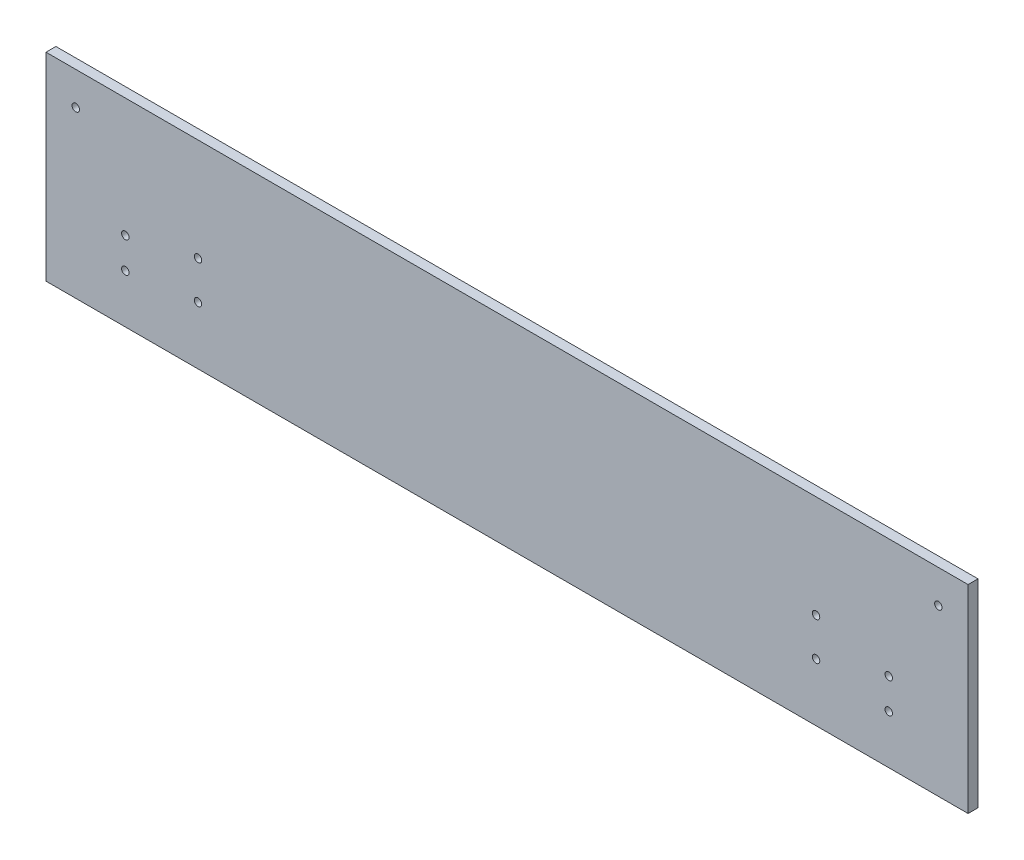
ISO-10303-21;
HEADER;
FILE_DESCRIPTION(('STEP AP214'),'2;1');
FILE_NAME('part.step','',(''),(''),'','','');
FILE_SCHEMA(('AUTOMOTIVE_DESIGN { 1 0 10303 214 1 1 1 1 }'));
ENDSEC;
DATA;
#1=APPLICATION_CONTEXT('core data for automotive mechanical design processes');
#2=APPLICATION_PROTOCOL_DEFINITION('international standard','automotive_design',2000,#1);
#3=PRODUCT_CONTEXT('',#1,'mechanical');
#4=PRODUCT('Part','Part','',(#3));
#5=PRODUCT_RELATED_PRODUCT_CATEGORY('part','',(#4));
#6=PRODUCT_DEFINITION_FORMATION('','',#4);
#7=PRODUCT_DEFINITION_CONTEXT('part definition',#1,'design');
#8=PRODUCT_DEFINITION('design','',#6,#7);
#9=PRODUCT_DEFINITION_SHAPE('','',#8);
#10=(LENGTH_UNIT() NAMED_UNIT(*) SI_UNIT(.MILLI.,.METRE.));
#11=(NAMED_UNIT(*) PLANE_ANGLE_UNIT() SI_UNIT($,.RADIAN.));
#12=(NAMED_UNIT(*) SI_UNIT($,.STERADIAN.) SOLID_ANGLE_UNIT());
#13=UNCERTAINTY_MEASURE_WITH_UNIT(LENGTH_MEASURE(1.E-05),#10,'distance_accuracy_value','');
#14=(GEOMETRIC_REPRESENTATION_CONTEXT(3) GLOBAL_UNCERTAINTY_ASSIGNED_CONTEXT((#13)) GLOBAL_UNIT_ASSIGNED_CONTEXT((#10,
#11,#12)) REPRESENTATION_CONTEXT('',''));
#15=CARTESIAN_POINT('',(0.,0.,0.));
#16=DIRECTION('',(0.,0.,1.));
#17=DIRECTION('',(1.,0.,0.));
#18=AXIS2_PLACEMENT_3D('',#15,#16,#17);
#19=CARTESIAN_POINT('',(-279.,60.,6.));
#20=DIRECTION('',(1.,0.,0.));
#21=DIRECTION('',(0.,0.,-1.));
#22=AXIS2_PLACEMENT_3D('',#19,#20,#21);
#23=PLANE('',#22);
#24=DIRECTION('',(0.,-1.,0.));
#25=VECTOR('',#24,1.);
#26=CARTESIAN_POINT('',(-279.,60.,0.));
#27=LINE('',#26,#25);
#28=CARTESIAN_POINT('',(-279.,60.,0.));
#29=VERTEX_POINT('',#28);
#30=CARTESIAN_POINT('',(-279.,-60.,0.));
#31=VERTEX_POINT('',#30);
#32=EDGE_CURVE('E103',#29,#31,#27,.T.);
#33=ORIENTED_EDGE('',*,*,#32,.T.);
#34=DIRECTION('',(0.,0.,-1.));
#35=VECTOR('',#34,1.);
#36=CARTESIAN_POINT('',(-279.,-60.,6.));
#37=LINE('',#36,#35);
#38=CARTESIAN_POINT('',(-279.,-60.,6.));
#39=VERTEX_POINT('',#38);
#40=EDGE_CURVE('E11',#39,#31,#37,.T.);
#41=ORIENTED_EDGE('',*,*,#40,.F.);
#42=DIRECTION('',(0.,-1.,0.));
#43=VECTOR('',#42,1.);
#44=CARTESIAN_POINT('',(-279.,60.,6.));
#45=LINE('',#44,#43);
#46=CARTESIAN_POINT('',(-279.,60.,6.));
#47=VERTEX_POINT('',#46);
#48=EDGE_CURVE('E90',#47,#39,#45,.T.);
#49=ORIENTED_EDGE('',*,*,#48,.F.);
#50=DIRECTION('',(0.,0.,-1.));
#51=VECTOR('',#50,1.);
#52=CARTESIAN_POINT('',(-279.,60.,6.));
#53=LINE('',#52,#51);
#54=EDGE_CURVE('E99',#47,#29,#53,.T.);
#55=ORIENTED_EDGE('',*,*,#54,.T.);
#56=EDGE_LOOP('',(#33,#41,#49,#55));
#57=FACE_BOUND('',#56,.T.);
#58=ADVANCED_FACE('F37',(#57),#23,.F.);
#59=CARTESIAN_POINT('',(-279.,-60.,6.));
#60=DIRECTION('',(0.,1.,0.));
#61=DIRECTION('',(0.,0.,1.));
#62=AXIS2_PLACEMENT_3D('',#59,#60,#61);
#63=PLANE('',#62);
#64=DIRECTION('',(1.,0.,0.));
#65=VECTOR('',#64,1.);
#66=CARTESIAN_POINT('',(-279.,-60.,0.));
#67=LINE('',#66,#65);
#68=CARTESIAN_POINT('',(279.,-60.,0.));
#69=VERTEX_POINT('',#68);
#70=EDGE_CURVE('E94',#31,#69,#67,.T.);
#71=ORIENTED_EDGE('',*,*,#70,.T.);
#72=DIRECTION('',(0.,0.,-1.));
#73=VECTOR('',#72,1.);
#74=CARTESIAN_POINT('',(279.,-60.,6.));
#75=LINE('',#74,#73);
#76=CARTESIAN_POINT('',(279.,-60.,6.));
#77=VERTEX_POINT('',#76);
#78=EDGE_CURVE('E46',#77,#69,#75,.T.);
#79=ORIENTED_EDGE('',*,*,#78,.F.);
#80=DIRECTION('',(1.,0.,0.));
#81=VECTOR('',#80,1.);
#82=CARTESIAN_POINT('',(-279.,-60.,6.));
#83=LINE('',#82,#81);
#84=EDGE_CURVE('E85',#39,#77,#83,.T.);
#85=ORIENTED_EDGE('',*,*,#84,.F.);
#86=ORIENTED_EDGE('',*,*,#40,.T.);
#87=EDGE_LOOP('',(#71,#79,#85,#86));
#88=FACE_BOUND('',#87,.T.);
#89=ADVANCED_FACE('F93',(#88),#63,.F.);
#90=CARTESIAN_POINT('',(279.,60.,6.));
#91=DIRECTION('',(-1.,0.,0.));
#92=DIRECTION('',(0.,0.,1.));
#93=AXIS2_PLACEMENT_3D('',#90,#91,#92);
#94=PLANE('',#93);
#95=DIRECTION('',(0.,1.,0.));
#96=VECTOR('',#95,1.);
#97=CARTESIAN_POINT('',(279.,60.,0.));
#98=LINE('',#97,#96);
#99=CARTESIAN_POINT('',(279.,60.,0.));
#100=VERTEX_POINT('',#99);
#101=EDGE_CURVE('E72',#69,#100,#98,.T.);
#102=ORIENTED_EDGE('',*,*,#101,.T.);
#103=DIRECTION('',(0.,0.,-1.));
#104=VECTOR('',#103,1.);
#105=CARTESIAN_POINT('',(279.,60.,6.));
#106=LINE('',#105,#104);
#107=CARTESIAN_POINT('',(279.,60.,6.));
#108=VERTEX_POINT('',#107);
#109=EDGE_CURVE('E95',#108,#100,#106,.T.);
#110=ORIENTED_EDGE('',*,*,#109,.F.);
#111=DIRECTION('',(0.,1.,0.));
#112=VECTOR('',#111,1.);
#113=CARTESIAN_POINT('',(279.,60.,6.));
#114=LINE('',#113,#112);
#115=EDGE_CURVE('E88',#77,#108,#114,.T.);
#116=ORIENTED_EDGE('',*,*,#115,.F.);
#117=ORIENTED_EDGE('',*,*,#78,.T.);
#118=EDGE_LOOP('',(#102,#110,#116,#117));
#119=FACE_BOUND('',#118,.T.);
#120=ADVANCED_FACE('F97',(#119),#94,.F.);
#121=CARTESIAN_POINT('',(-279.,60.,6.));
#122=DIRECTION('',(0.,-1.,0.));
#123=DIRECTION('',(0.,0.,-1.));
#124=AXIS2_PLACEMENT_3D('',#121,#122,#123);
#125=PLANE('',#124);
#126=DIRECTION('',(-1.,0.,0.));
#127=VECTOR('',#126,1.);
#128=CARTESIAN_POINT('',(-279.,60.,0.));
#129=LINE('',#128,#127);
#130=EDGE_CURVE('E78',#100,#29,#129,.T.);
#131=ORIENTED_EDGE('',*,*,#130,.T.);
#132=ORIENTED_EDGE('',*,*,#54,.F.);
#133=DIRECTION('',(-1.,0.,0.));
#134=VECTOR('',#133,1.);
#135=CARTESIAN_POINT('',(-279.,60.,6.));
#136=LINE('',#135,#134);
#137=EDGE_CURVE('E55',#108,#47,#136,.T.);
#138=ORIENTED_EDGE('',*,*,#137,.F.);
#139=ORIENTED_EDGE('',*,*,#109,.T.);
#140=EDGE_LOOP('',(#131,#132,#138,#139));
#141=FACE_BOUND('',#140,.T.);
#142=ADVANCED_FACE('F174',(#141),#125,.F.);
#143=CARTESIAN_POINT('',(0.,0.,6.));
#144=DIRECTION('',(0.,0.,1.));
#145=DIRECTION('',(1.,0.,0.));
#146=AXIS2_PLACEMENT_3D('',#143,#144,#145);
#147=PLANE('',#146);
#148=CARTESIAN_POINT('',(261.,40.,6.));
#149=DIRECTION('',(0.,0.,1.));
#150=DIRECTION('',(1.,0.,0.));
#151=AXIS2_PLACEMENT_3D('',#148,#149,#150);
#152=CIRCLE('',#151,2.24999999999995);
#153=CARTESIAN_POINT('',(263.25,40.,6.));
#154=VERTEX_POINT('',#153);
#155=EDGE_CURVE('E360',#154,#154,#152,.T.);
#156=ORIENTED_EDGE('',*,*,#155,.F.);
#157=EDGE_LOOP('',(#156));
#158=FACE_BOUND('',#157,.T.);
#159=CARTESIAN_POINT('',(187.,-25.,6.));
#160=DIRECTION('',(0.,0.,1.));
#161=DIRECTION('',(1.,0.,0.));
#162=AXIS2_PLACEMENT_3D('',#159,#160,#161);
#163=CIRCLE('',#162,2.25000000000001);
#164=CARTESIAN_POINT('',(189.25,-25.,6.));
#165=VERTEX_POINT('',#164);
#166=EDGE_CURVE('E356',#165,#165,#163,.T.);
#167=ORIENTED_EDGE('',*,*,#166,.F.);
#168=EDGE_LOOP('',(#167));
#169=FACE_BOUND('',#168,.T.);
#170=CARTESIAN_POINT('',(187.,-2.,6.));
#171=DIRECTION('',(0.,0.,1.));
#172=DIRECTION('',(1.,0.,0.));
#173=AXIS2_PLACEMENT_3D('',#170,#171,#172);
#174=CIRCLE('',#173,2.25000000000001);
#175=CARTESIAN_POINT('',(189.25,-2.,6.));
#176=VERTEX_POINT('',#175);
#177=EDGE_CURVE('E331',#176,#176,#174,.T.);
#178=ORIENTED_EDGE('',*,*,#177,.F.);
#179=EDGE_LOOP('',(#178));
#180=FACE_BOUND('',#179,.T.);
#181=CARTESIAN_POINT('',(-187.,-2.,6.));
#182=DIRECTION('',(0.,0.,1.));
#183=DIRECTION('',(1.,0.,0.));
#184=AXIS2_PLACEMENT_3D('',#181,#182,#183);
#185=CIRCLE('',#184,2.25000000000001);
#186=CARTESIAN_POINT('',(-184.75,-2.,6.));
#187=VERTEX_POINT('',#186);
#188=EDGE_CURVE('E357',#187,#187,#185,.T.);
#189=ORIENTED_EDGE('',*,*,#188,.F.);
#190=EDGE_LOOP('',(#189));
#191=FACE_BOUND('',#190,.T.);
#192=CARTESIAN_POINT('',(-231.,-30.5,6.));
#193=DIRECTION('',(0.,0.,1.));
#194=DIRECTION('',(1.,0.,0.));
#195=AXIS2_PLACEMENT_3D('',#192,#193,#194);
#196=CIRCLE('',#195,2.25000000000001);
#197=CARTESIAN_POINT('',(-228.75,-30.5,6.));
#198=VERTEX_POINT('',#197);
#199=EDGE_CURVE('E375',#198,#198,#196,.T.);
#200=ORIENTED_EDGE('',*,*,#199,.F.);
#201=EDGE_LOOP('',(#200));
#202=FACE_BOUND('',#201,.T.);
#203=CARTESIAN_POINT('',(231.,-12.,6.));
#204=DIRECTION('',(0.,0.,1.));
#205=DIRECTION('',(1.,0.,0.));
#206=AXIS2_PLACEMENT_3D('',#203,#204,#205);
#207=CIRCLE('',#206,2.25000000000001);
#208=CARTESIAN_POINT('',(233.25,-12.,6.));
#209=VERTEX_POINT('',#208);
#210=EDGE_CURVE('E372',#209,#209,#207,.T.);
#211=ORIENTED_EDGE('',*,*,#210,.F.);
#212=EDGE_LOOP('',(#211));
#213=FACE_BOUND('',#212,.T.);
#214=CARTESIAN_POINT('',(231.,-30.5,6.));
#215=DIRECTION('',(0.,0.,1.));
#216=DIRECTION('',(1.,0.,0.));
#217=AXIS2_PLACEMENT_3D('',#214,#215,#216);
#218=CIRCLE('',#217,2.25000000000001);
#219=CARTESIAN_POINT('',(233.25,-30.5,6.));
#220=VERTEX_POINT('',#219);
#221=EDGE_CURVE('E369',#220,#220,#218,.T.);
#222=ORIENTED_EDGE('',*,*,#221,.F.);
#223=EDGE_LOOP('',(#222));
#224=FACE_BOUND('',#223,.T.);
#225=CARTESIAN_POINT('',(-261.,39.9999999999999,6.));
#226=DIRECTION('',(0.,0.,1.));
#227=DIRECTION('',(1.,0.,0.));
#228=AXIS2_PLACEMENT_3D('',#225,#226,#227);
#229=CIRCLE('',#228,2.24999999999995);
#230=CARTESIAN_POINT('',(-258.75,39.9999999999999,6.));
#231=VERTEX_POINT('',#230);
#232=EDGE_CURVE('E367',#231,#231,#229,.T.);
#233=ORIENTED_EDGE('',*,*,#232,.F.);
#234=EDGE_LOOP('',(#233));
#235=FACE_BOUND('',#234,.T.);
#236=CARTESIAN_POINT('',(-187.,-25.,6.));
#237=DIRECTION('',(0.,0.,1.));
#238=DIRECTION('',(1.,0.,0.));
#239=AXIS2_PLACEMENT_3D('',#236,#237,#238);
#240=CIRCLE('',#239,2.25000000000001);
#241=CARTESIAN_POINT('',(-184.75,-25.,6.));
#242=VERTEX_POINT('',#241);
#243=EDGE_CURVE('E363',#242,#242,#240,.T.);
#244=ORIENTED_EDGE('',*,*,#243,.F.);
#245=EDGE_LOOP('',(#244));
#246=FACE_BOUND('',#245,.T.);
#247=CARTESIAN_POINT('',(-231.,-12.,6.));
#248=DIRECTION('',(0.,0.,1.));
#249=DIRECTION('',(1.,0.,0.));
#250=AXIS2_PLACEMENT_3D('',#247,#248,#249);
#251=CIRCLE('',#250,2.25000000000001);
#252=CARTESIAN_POINT('',(-228.75,-12.,6.));
#253=VERTEX_POINT('',#252);
#254=EDGE_CURVE('E115',#253,#253,#251,.T.);
#255=ORIENTED_EDGE('',*,*,#254,.F.);
#256=EDGE_LOOP('',(#255));
#257=FACE_BOUND('',#256,.T.);
#258=ORIENTED_EDGE('',*,*,#48,.T.);
#259=ORIENTED_EDGE('',*,*,#84,.T.);
#260=ORIENTED_EDGE('',*,*,#115,.T.);
#261=ORIENTED_EDGE('',*,*,#137,.T.);
#262=EDGE_LOOP('',(#258,#259,#260,#261));
#263=FACE_BOUND('',#262,.T.);
#264=ADVANCED_FACE('F86',(#158,#169,#180,#191,#202,#213,#224,#235,#246,#257,#263),#147,.T.);
#265=CARTESIAN_POINT('',(0.,0.,0.));
#266=DIRECTION('',(0.,0.,1.));
#267=DIRECTION('',(1.,0.,0.));
#268=AXIS2_PLACEMENT_3D('',#265,#266,#267);
#269=PLANE('',#268);
#270=CARTESIAN_POINT('',(261.,40.,0.));
#271=DIRECTION('',(0.,0.,1.));
#272=DIRECTION('',(1.,0.,0.));
#273=AXIS2_PLACEMENT_3D('',#270,#271,#272);
#274=CIRCLE('',#273,2.24999999999995);
#275=CARTESIAN_POINT('',(263.25,40.,0.));
#276=VERTEX_POINT('',#275);
#277=EDGE_CURVE('E40',#276,#276,#274,.T.);
#278=ORIENTED_EDGE('',*,*,#277,.T.);
#279=EDGE_LOOP('',(#278));
#280=FACE_BOUND('',#279,.T.);
#281=CARTESIAN_POINT('',(187.,-25.,0.));
#282=DIRECTION('',(0.,0.,1.));
#283=DIRECTION('',(1.,0.,0.));
#284=AXIS2_PLACEMENT_3D('',#281,#282,#283);
#285=CIRCLE('',#284,2.25000000000001);
#286=CARTESIAN_POINT('',(189.25,-25.,0.));
#287=VERTEX_POINT('',#286);
#288=EDGE_CURVE('E135',#287,#287,#285,.T.);
#289=ORIENTED_EDGE('',*,*,#288,.T.);
#290=EDGE_LOOP('',(#289));
#291=FACE_BOUND('',#290,.T.);
#292=CARTESIAN_POINT('',(187.,-2.,0.));
#293=DIRECTION('',(0.,0.,1.));
#294=DIRECTION('',(1.,0.,0.));
#295=AXIS2_PLACEMENT_3D('',#292,#293,#294);
#296=CIRCLE('',#295,2.25000000000001);
#297=CARTESIAN_POINT('',(189.25,-2.,0.));
#298=VERTEX_POINT('',#297);
#299=EDGE_CURVE('E133',#298,#298,#296,.T.);
#300=ORIENTED_EDGE('',*,*,#299,.T.);
#301=EDGE_LOOP('',(#300));
#302=FACE_BOUND('',#301,.T.);
#303=CARTESIAN_POINT('',(-187.,-2.,0.));
#304=DIRECTION('',(0.,0.,1.));
#305=DIRECTION('',(1.,0.,0.));
#306=AXIS2_PLACEMENT_3D('',#303,#304,#305);
#307=CIRCLE('',#306,2.25000000000001);
#308=CARTESIAN_POINT('',(-184.75,-2.,0.));
#309=VERTEX_POINT('',#308);
#310=EDGE_CURVE('E130',#309,#309,#307,.T.);
#311=ORIENTED_EDGE('',*,*,#310,.T.);
#312=EDGE_LOOP('',(#311));
#313=FACE_BOUND('',#312,.T.);
#314=CARTESIAN_POINT('',(-231.,-30.5,0.));
#315=DIRECTION('',(0.,0.,1.));
#316=DIRECTION('',(1.,0.,0.));
#317=AXIS2_PLACEMENT_3D('',#314,#315,#316);
#318=CIRCLE('',#317,2.25000000000001);
#319=CARTESIAN_POINT('',(-228.75,-30.5,0.));
#320=VERTEX_POINT('',#319);
#321=EDGE_CURVE('E127',#320,#320,#318,.T.);
#322=ORIENTED_EDGE('',*,*,#321,.T.);
#323=EDGE_LOOP('',(#322));
#324=FACE_BOUND('',#323,.T.);
#325=CARTESIAN_POINT('',(231.,-12.,0.));
#326=DIRECTION('',(0.,0.,1.));
#327=DIRECTION('',(1.,0.,0.));
#328=AXIS2_PLACEMENT_3D('',#325,#326,#327);
#329=CIRCLE('',#328,2.25000000000001);
#330=CARTESIAN_POINT('',(233.25,-12.,0.));
#331=VERTEX_POINT('',#330);
#332=EDGE_CURVE('E124',#331,#331,#329,.T.);
#333=ORIENTED_EDGE('',*,*,#332,.T.);
#334=EDGE_LOOP('',(#333));
#335=FACE_BOUND('',#334,.T.);
#336=CARTESIAN_POINT('',(231.,-30.5,0.));
#337=DIRECTION('',(0.,0.,1.));
#338=DIRECTION('',(1.,0.,0.));
#339=AXIS2_PLACEMENT_3D('',#336,#337,#338);
#340=CIRCLE('',#339,2.25000000000001);
#341=CARTESIAN_POINT('',(233.25,-30.5,0.));
#342=VERTEX_POINT('',#341);
#343=EDGE_CURVE('E121',#342,#342,#340,.T.);
#344=ORIENTED_EDGE('',*,*,#343,.T.);
#345=EDGE_LOOP('',(#344));
#346=FACE_BOUND('',#345,.T.);
#347=CARTESIAN_POINT('',(-261.,39.9999999999999,0.));
#348=DIRECTION('',(0.,0.,1.));
#349=DIRECTION('',(1.,0.,0.));
#350=AXIS2_PLACEMENT_3D('',#347,#348,#349);
#351=CIRCLE('',#350,2.24999999999995);
#352=CARTESIAN_POINT('',(-258.75,39.9999999999999,0.));
#353=VERTEX_POINT('',#352);
#354=EDGE_CURVE('E118',#353,#353,#351,.T.);
#355=ORIENTED_EDGE('',*,*,#354,.T.);
#356=EDGE_LOOP('',(#355));
#357=FACE_BOUND('',#356,.T.);
#358=CARTESIAN_POINT('',(-187.,-25.,0.));
#359=DIRECTION('',(0.,0.,1.));
#360=DIRECTION('',(1.,0.,0.));
#361=AXIS2_PLACEMENT_3D('',#358,#359,#360);
#362=CIRCLE('',#361,2.25000000000001);
#363=CARTESIAN_POINT('',(-184.75,-25.,0.));
#364=VERTEX_POINT('',#363);
#365=EDGE_CURVE('E114',#364,#364,#362,.T.);
#366=ORIENTED_EDGE('',*,*,#365,.T.);
#367=EDGE_LOOP('',(#366));
#368=FACE_BOUND('',#367,.T.);
#369=CARTESIAN_POINT('',(-231.,-12.,0.));
#370=DIRECTION('',(0.,0.,1.));
#371=DIRECTION('',(1.,0.,0.));
#372=AXIS2_PLACEMENT_3D('',#369,#370,#371);
#373=CIRCLE('',#372,2.25000000000001);
#374=CARTESIAN_POINT('',(-228.75,-12.,0.));
#375=VERTEX_POINT('',#374);
#376=EDGE_CURVE('E111',#375,#375,#373,.T.);
#377=ORIENTED_EDGE('',*,*,#376,.T.);
#378=EDGE_LOOP('',(#377));
#379=FACE_BOUND('',#378,.T.);
#380=ORIENTED_EDGE('',*,*,#32,.F.);
#381=ORIENTED_EDGE('',*,*,#130,.F.);
#382=ORIENTED_EDGE('',*,*,#101,.F.);
#383=ORIENTED_EDGE('',*,*,#70,.F.);
#384=EDGE_LOOP('',(#380,#381,#382,#383));
#385=FACE_BOUND('',#384,.T.);
#386=ADVANCED_FACE('F142',(#280,#291,#302,#313,#324,#335,#346,#357,#368,#379,#385),#269,.F.);
#387=CARTESIAN_POINT('',(-231.,-12.,-4.));
#388=DIRECTION('',(0.,0.,1.));
#389=DIRECTION('',(1.,0.,0.));
#390=AXIS2_PLACEMENT_3D('',#387,#388,#389);
#391=CYLINDRICAL_SURFACE('',#390,2.25000000000001);
#392=ORIENTED_EDGE('',*,*,#254,.T.);
#393=EDGE_LOOP('',(#392));
#394=FACE_BOUND('',#393,.T.);
#395=ORIENTED_EDGE('',*,*,#376,.F.);
#396=EDGE_LOOP('',(#395));
#397=FACE_BOUND('',#396,.T.);
#398=ADVANCED_FACE('F165',(#394,#397),#391,.F.);
#399=CARTESIAN_POINT('',(-187.,-25.,-4.));
#400=DIRECTION('',(0.,0.,1.));
#401=DIRECTION('',(1.,0.,0.));
#402=AXIS2_PLACEMENT_3D('',#399,#400,#401);
#403=CYLINDRICAL_SURFACE('',#402,2.25000000000001);
#404=ORIENTED_EDGE('',*,*,#243,.T.);
#405=EDGE_LOOP('',(#404));
#406=FACE_BOUND('',#405,.T.);
#407=ORIENTED_EDGE('',*,*,#365,.F.);
#408=EDGE_LOOP('',(#407));
#409=FACE_BOUND('',#408,.T.);
#410=ADVANCED_FACE('F171',(#406,#409),#403,.F.);
#411=CARTESIAN_POINT('',(-261.,39.9999999999999,-4.));
#412=DIRECTION('',(0.,0.,1.));
#413=DIRECTION('',(1.,0.,0.));
#414=AXIS2_PLACEMENT_3D('',#411,#412,#413);
#415=CYLINDRICAL_SURFACE('',#414,2.24999999999995);
#416=ORIENTED_EDGE('',*,*,#232,.T.);
#417=EDGE_LOOP('',(#416));
#418=FACE_BOUND('',#417,.T.);
#419=ORIENTED_EDGE('',*,*,#354,.F.);
#420=EDGE_LOOP('',(#419));
#421=FACE_BOUND('',#420,.T.);
#422=ADVANCED_FACE('F215',(#418,#421),#415,.F.);
#423=CARTESIAN_POINT('',(231.,-30.5,-4.));
#424=DIRECTION('',(0.,0.,1.));
#425=DIRECTION('',(1.,0.,0.));
#426=AXIS2_PLACEMENT_3D('',#423,#424,#425);
#427=CYLINDRICAL_SURFACE('',#426,2.25000000000001);
#428=ORIENTED_EDGE('',*,*,#221,.T.);
#429=EDGE_LOOP('',(#428));
#430=FACE_BOUND('',#429,.T.);
#431=ORIENTED_EDGE('',*,*,#343,.F.);
#432=EDGE_LOOP('',(#431));
#433=FACE_BOUND('',#432,.T.);
#434=ADVANCED_FACE('F226',(#430,#433),#427,.F.);
#435=CARTESIAN_POINT('',(231.,-12.,-4.));
#436=DIRECTION('',(0.,0.,1.));
#437=DIRECTION('',(1.,0.,0.));
#438=AXIS2_PLACEMENT_3D('',#435,#436,#437);
#439=CYLINDRICAL_SURFACE('',#438,2.25000000000001);
#440=ORIENTED_EDGE('',*,*,#210,.T.);
#441=EDGE_LOOP('',(#440));
#442=FACE_BOUND('',#441,.T.);
#443=ORIENTED_EDGE('',*,*,#332,.F.);
#444=EDGE_LOOP('',(#443));
#445=FACE_BOUND('',#444,.T.);
#446=ADVANCED_FACE('F237',(#442,#445),#439,.F.);
#447=CARTESIAN_POINT('',(-231.,-30.5,-4.));
#448=DIRECTION('',(0.,0.,1.));
#449=DIRECTION('',(1.,0.,0.));
#450=AXIS2_PLACEMENT_3D('',#447,#448,#449);
#451=CYLINDRICAL_SURFACE('',#450,2.25000000000001);
#452=ORIENTED_EDGE('',*,*,#199,.T.);
#453=EDGE_LOOP('',(#452));
#454=FACE_BOUND('',#453,.T.);
#455=ORIENTED_EDGE('',*,*,#321,.F.);
#456=EDGE_LOOP('',(#455));
#457=FACE_BOUND('',#456,.T.);
#458=ADVANCED_FACE('F248',(#454,#457),#451,.F.);
#459=CARTESIAN_POINT('',(-187.,-2.,-4.));
#460=DIRECTION('',(0.,0.,1.));
#461=DIRECTION('',(1.,0.,0.));
#462=AXIS2_PLACEMENT_3D('',#459,#460,#461);
#463=CYLINDRICAL_SURFACE('',#462,2.25000000000001);
#464=ORIENTED_EDGE('',*,*,#188,.T.);
#465=EDGE_LOOP('',(#464));
#466=FACE_BOUND('',#465,.T.);
#467=ORIENTED_EDGE('',*,*,#310,.F.);
#468=EDGE_LOOP('',(#467));
#469=FACE_BOUND('',#468,.T.);
#470=ADVANCED_FACE('F259',(#466,#469),#463,.F.);
#471=CARTESIAN_POINT('',(187.,-2.,-4.));
#472=DIRECTION('',(0.,0.,1.));
#473=DIRECTION('',(1.,0.,0.));
#474=AXIS2_PLACEMENT_3D('',#471,#472,#473);
#475=CYLINDRICAL_SURFACE('',#474,2.25000000000001);
#476=ORIENTED_EDGE('',*,*,#177,.T.);
#477=EDGE_LOOP('',(#476));
#478=FACE_BOUND('',#477,.T.);
#479=ORIENTED_EDGE('',*,*,#299,.F.);
#480=EDGE_LOOP('',(#479));
#481=FACE_BOUND('',#480,.T.);
#482=ADVANCED_FACE('F152',(#478,#481),#475,.F.);
#483=CARTESIAN_POINT('',(187.,-25.,-4.));
#484=DIRECTION('',(0.,0.,1.));
#485=DIRECTION('',(1.,0.,0.));
#486=AXIS2_PLACEMENT_3D('',#483,#484,#485);
#487=CYLINDRICAL_SURFACE('',#486,2.25000000000001);
#488=ORIENTED_EDGE('',*,*,#166,.T.);
#489=EDGE_LOOP('',(#488));
#490=FACE_BOUND('',#489,.T.);
#491=ORIENTED_EDGE('',*,*,#288,.F.);
#492=EDGE_LOOP('',(#491));
#493=FACE_BOUND('',#492,.T.);
#494=ADVANCED_FACE('F146',(#490,#493),#487,.F.);
#495=CARTESIAN_POINT('',(261.,40.,-4.));
#496=DIRECTION('',(0.,0.,1.));
#497=DIRECTION('',(1.,0.,0.));
#498=AXIS2_PLACEMENT_3D('',#495,#496,#497);
#499=CYLINDRICAL_SURFACE('',#498,2.24999999999995);
#500=ORIENTED_EDGE('',*,*,#155,.T.);
#501=EDGE_LOOP('',(#500));
#502=FACE_BOUND('',#501,.T.);
#503=ORIENTED_EDGE('',*,*,#277,.F.);
#504=EDGE_LOOP('',(#503));
#505=FACE_BOUND('',#504,.T.);
#506=ADVANCED_FACE('F144',(#502,#505),#499,.F.);
#507=CLOSED_SHELL('',(#58,#89,#120,#142,#264,#386,#398,#410,#422,#434,#446,#458,#470,#482,#494,#506));
#508=MANIFOLD_SOLID_BREP('B2',#507);
#509=ADVANCED_BREP_SHAPE_REPRESENTATION('',(#18,#508),#14);
#510=SHAPE_DEFINITION_REPRESENTATION(#9,#509);
ENDSEC;
END-ISO-10303-21;
